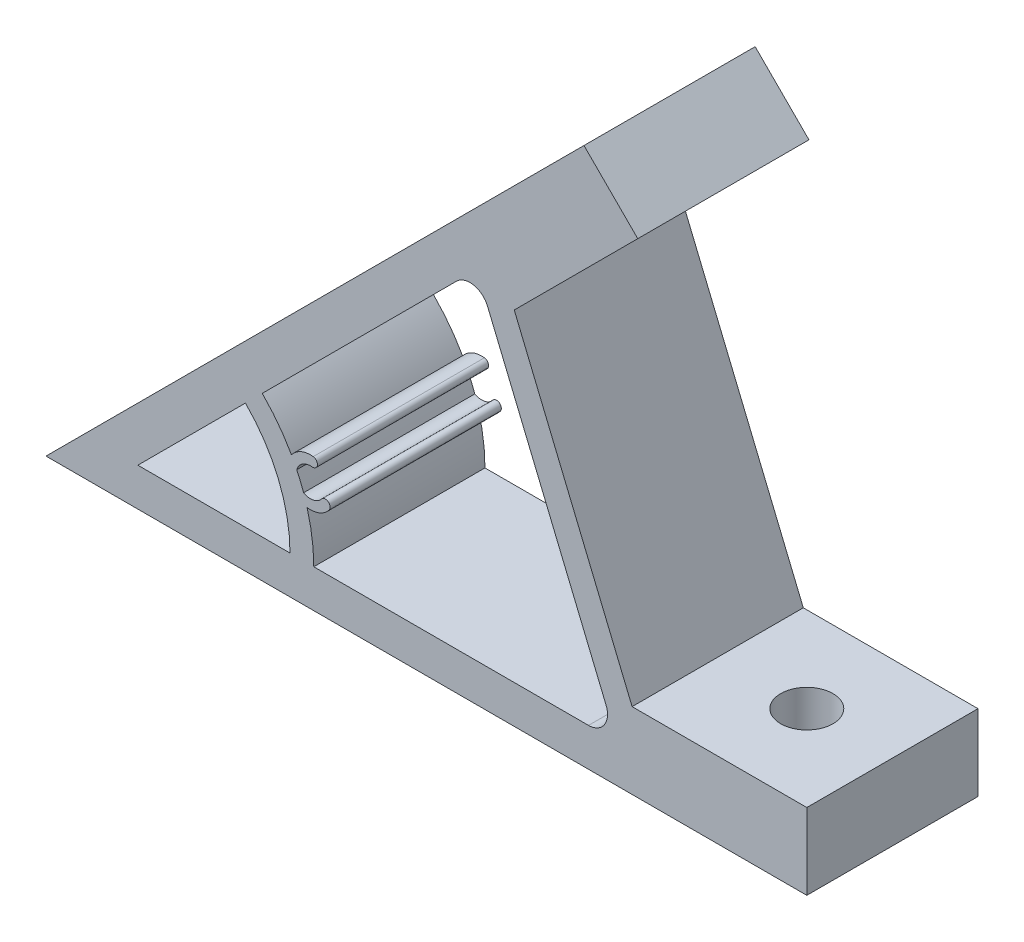
ISO-10303-21;
HEADER;
FILE_DESCRIPTION(('STEP AP214'),'2;1');
FILE_NAME('part.step','',(''),(''),'','','');
FILE_SCHEMA(('AUTOMOTIVE_DESIGN { 1 0 10303 214 1 1 1 1 }'));
ENDSEC;
DATA;
#1=APPLICATION_CONTEXT('core data for automotive mechanical design processes');
#2=APPLICATION_PROTOCOL_DEFINITION('international standard','automotive_design',2000,#1);
#3=PRODUCT_CONTEXT('',#1,'mechanical');
#4=PRODUCT('Part','Part','',(#3));
#5=PRODUCT_RELATED_PRODUCT_CATEGORY('part','',(#4));
#6=PRODUCT_DEFINITION_FORMATION('','',#4);
#7=PRODUCT_DEFINITION_CONTEXT('part definition',#1,'design');
#8=PRODUCT_DEFINITION('design','',#6,#7);
#9=PRODUCT_DEFINITION_SHAPE('','',#8);
#10=(LENGTH_UNIT() NAMED_UNIT(*) SI_UNIT(.MILLI.,.METRE.));
#11=(NAMED_UNIT(*) PLANE_ANGLE_UNIT() SI_UNIT($,.RADIAN.));
#12=(NAMED_UNIT(*) SI_UNIT($,.STERADIAN.) SOLID_ANGLE_UNIT());
#13=UNCERTAINTY_MEASURE_WITH_UNIT(LENGTH_MEASURE(1.E-05),#10,'distance_accuracy_value','');
#14=(GEOMETRIC_REPRESENTATION_CONTEXT(3) GLOBAL_UNCERTAINTY_ASSIGNED_CONTEXT((#13)) GLOBAL_UNIT_ASSIGNED_CONTEXT((#10,
#11,#12)) REPRESENTATION_CONTEXT('',''));
#15=CARTESIAN_POINT('',(0.,0.,0.));
#16=DIRECTION('',(0.,0.,1.));
#17=DIRECTION('',(1.,0.,0.));
#18=AXIS2_PLACEMENT_3D('',#15,#16,#17);
#19=CARTESIAN_POINT('',(80.,0.,18.));
#20=DIRECTION('',(-1.,0.,0.));
#21=DIRECTION('',(0.,0.,1.));
#22=AXIS2_PLACEMENT_3D('',#19,#20,#21);
#23=PLANE('',#22);
#24=DIRECTION('',(0.,1.,0.));
#25=VECTOR('',#24,1.);
#26=CARTESIAN_POINT('',(80.,0.,0.));
#27=LINE('',#26,#25);
#28=CARTESIAN_POINT('',(80.,0.,0.));
#29=VERTEX_POINT('',#28);
#30=CARTESIAN_POINT('',(80.,8.,0.));
#31=VERTEX_POINT('',#30);
#32=EDGE_CURVE('E275',#29,#31,#27,.T.);
#33=ORIENTED_EDGE('',*,*,#32,.T.);
#34=DIRECTION('',(0.,0.,-1.));
#35=VECTOR('',#34,1.);
#36=CARTESIAN_POINT('',(80.,8.,18.));
#37=LINE('',#36,#35);
#38=CARTESIAN_POINT('',(80.,8.,18.));
#39=VERTEX_POINT('',#38);
#40=EDGE_CURVE('E11',#39,#31,#37,.T.);
#41=ORIENTED_EDGE('',*,*,#40,.F.);
#42=DIRECTION('',(0.,1.,0.));
#43=VECTOR('',#42,1.);
#44=CARTESIAN_POINT('',(80.,0.,18.));
#45=LINE('',#44,#43);
#46=CARTESIAN_POINT('',(80.,0.,18.));
#47=VERTEX_POINT('',#46);
#48=EDGE_CURVE('E384',#47,#39,#45,.T.);
#49=ORIENTED_EDGE('',*,*,#48,.F.);
#50=DIRECTION('',(0.,0.,-1.));
#51=VECTOR('',#50,1.);
#52=CARTESIAN_POINT('',(80.,0.,18.));
#53=LINE('',#52,#51);
#54=EDGE_CURVE('E292',#47,#29,#53,.T.);
#55=ORIENTED_EDGE('',*,*,#54,.T.);
#56=EDGE_LOOP('',(#33,#41,#49,#55));
#57=FACE_BOUND('',#56,.T.);
#58=ADVANCED_FACE('F32',(#57),#23,.F.);
#59=CARTESIAN_POINT('',(0.,7.99999999999999,18.));
#60=DIRECTION('',(0.,-1.,0.));
#61=DIRECTION('',(1.,0.,0.));
#62=AXIS2_PLACEMENT_3D('',#59,#60,#61);
#63=PLANE('',#62);
#64=CARTESIAN_POINT('',(71.,8.,9.));
#65=DIRECTION('',(0.,1.,0.));
#66=DIRECTION('',(-1.,0.,0.));
#67=AXIS2_PLACEMENT_3D('',#64,#65,#66);
#68=CIRCLE('',#67,2.75000000000001);
#69=CARTESIAN_POINT('',(68.25,8.,9.));
#70=VERTEX_POINT('',#69);
#71=EDGE_CURVE('E332',#70,#70,#68,.T.);
#72=ORIENTED_EDGE('',*,*,#71,.F.);
#73=EDGE_LOOP('',(#72));
#74=FACE_BOUND('',#73,.T.);
#75=DIRECTION('',(-1.,0.,0.));
#76=VECTOR('',#75,1.);
#77=CARTESIAN_POINT('',(0.,7.99999999999999,0.));
#78=LINE('',#77,#76);
#79=CARTESIAN_POINT('',(61.6298235185589,8.,0.));
#80=VERTEX_POINT('',#79);
#81=EDGE_CURVE('E278',#31,#80,#78,.T.);
#82=ORIENTED_EDGE('',*,*,#81,.T.);
#83=DIRECTION('',(0.,0.,-1.));
#84=VECTOR('',#83,1.);
#85=CARTESIAN_POINT('',(61.6298235185589,8.,18.));
#86=LINE('',#85,#84);
#87=CARTESIAN_POINT('',(61.6298235185589,8.,18.));
#88=VERTEX_POINT('',#87);
#89=EDGE_CURVE('E42',#88,#80,#86,.T.);
#90=ORIENTED_EDGE('',*,*,#89,.F.);
#91=DIRECTION('',(-1.,0.,0.));
#92=VECTOR('',#91,1.);
#93=CARTESIAN_POINT('',(0.,7.99999999999999,18.));
#94=LINE('',#93,#92);
#95=EDGE_CURVE('E386',#39,#88,#94,.T.);
#96=ORIENTED_EDGE('',*,*,#95,.F.);
#97=ORIENTED_EDGE('',*,*,#40,.T.);
#98=EDGE_LOOP('',(#82,#90,#96,#97));
#99=FACE_BOUND('',#98,.T.);
#100=ADVANCED_FACE('F416',(#74,#99),#63,.F.);
#101=CARTESIAN_POINT('',(55.4327719506771,22.9610059419056,18.));
#102=DIRECTION('',(0.923879532511285,0.382683432365094,0.));
#103=DIRECTION('',(-0.382683432365094,0.923879532511285,0.));
#104=AXIS2_PLACEMENT_3D('',#101,#102,#103);
#105=PLANE('',#104);
#106=DIRECTION('',(0.382683432365094,-0.923879532511285,0.));
#107=VECTOR('',#106,1.);
#108=CARTESIAN_POINT('',(55.4327719506771,22.9610059419056,0.));
#109=LINE('',#108,#107);
#110=CARTESIAN_POINT('',(49.2357203827954,37.9220118838108,0.));
#111=VERTEX_POINT('',#110);
#112=EDGE_CURVE('E281',#111,#80,#109,.T.);
#113=ORIENTED_EDGE('',*,*,#112,.F.);
#114=DIRECTION('',(0.,0.,-1.));
#115=VECTOR('',#114,1.);
#116=CARTESIAN_POINT('',(49.2357203827954,37.9220118838108,18.));
#117=LINE('',#116,#115);
#118=CARTESIAN_POINT('',(49.2357203827954,37.9220118838108,18.));
#119=VERTEX_POINT('',#118);
#120=EDGE_CURVE('E297',#119,#111,#117,.T.);
#121=ORIENTED_EDGE('',*,*,#120,.F.);
#122=DIRECTION('',(0.382683432365094,-0.923879532511285,0.));
#123=VECTOR('',#122,1.);
#124=CARTESIAN_POINT('',(55.4327719506771,22.9610059419056,18.));
#125=LINE('',#124,#123);
#126=EDGE_CURVE('E388',#119,#88,#125,.T.);
#127=ORIENTED_EDGE('',*,*,#126,.T.);
#128=ORIENTED_EDGE('',*,*,#89,.T.);
#129=EDGE_LOOP('',(#113,#121,#127,#128));
#130=FACE_BOUND('',#129,.T.);
#131=ADVANCED_FACE('F421',(#130),#105,.T.);
#132=CARTESIAN_POINT('',(5.65685424949238,-5.65685424949236,18.));
#133=DIRECTION('',(0.707106781186549,-0.707106781186546,0.));
#134=DIRECTION('',(0.707106781186546,0.707106781186549,0.));
#135=AXIS2_PLACEMENT_3D('',#132,#133,#134);
#136=PLANE('',#135);
#137=CARTESIAN_POINT('',(55.8614357137372,44.5477272147526,9.));
#138=DIRECTION('',(0.707106781186549,-0.707106781186546,0.));
#139=DIRECTION('',(0.707106781186546,0.707106781186549,0.));
#140=AXIS2_PLACEMENT_3D('',#137,#138,#139);
#141=CIRCLE('',#140,2.75);
#142=CARTESIAN_POINT('',(57.8059793620002,46.4922708630156,9.));
#143=VERTEX_POINT('',#142);
#144=EDGE_CURVE('E340',#143,#143,#141,.T.);
#145=ORIENTED_EDGE('',*,*,#144,.F.);
#146=EDGE_LOOP('',(#145));
#147=FACE_BOUND('',#146,.T.);
#148=DIRECTION('',(-0.707106781186546,-0.707106781186549,0.));
#149=VECTOR('',#148,1.);
#150=CARTESIAN_POINT('',(5.65685424949238,-5.65685424949236,0.));
#151=LINE('',#150,#149);
#152=CARTESIAN_POINT('',(62.2253967444161,50.9116882454316,0.));
#153=VERTEX_POINT('',#152);
#154=EDGE_CURVE('E284',#153,#111,#151,.T.);
#155=ORIENTED_EDGE('',*,*,#154,.F.);
#156=DIRECTION('',(0.,0.,-1.));
#157=VECTOR('',#156,1.);
#158=CARTESIAN_POINT('',(62.2253967444161,50.9116882454316,18.));
#159=LINE('',#158,#157);
#160=CARTESIAN_POINT('',(62.2253967444161,50.9116882454316,18.));
#161=VERTEX_POINT('',#160);
#162=EDGE_CURVE('E213',#161,#153,#159,.T.);
#163=ORIENTED_EDGE('',*,*,#162,.F.);
#164=DIRECTION('',(-0.707106781186546,-0.707106781186549,0.));
#165=VECTOR('',#164,1.);
#166=CARTESIAN_POINT('',(5.65685424949238,-5.65685424949236,18.));
#167=LINE('',#166,#165);
#168=EDGE_CURVE('E220',#161,#119,#167,.T.);
#169=ORIENTED_EDGE('',*,*,#168,.T.);
#170=ORIENTED_EDGE('',*,*,#120,.T.);
#171=EDGE_LOOP('',(#155,#163,#169,#170));
#172=FACE_BOUND('',#171,.T.);
#173=ADVANCED_FACE('F392',(#147,#172),#136,.T.);
#174=CARTESIAN_POINT('',(56.5685424949237,56.5685424949239,18.));
#175=DIRECTION('',(0.707106781186546,0.707106781186549,0.));
#176=DIRECTION('',(-0.707106781186549,0.707106781186546,0.));
#177=AXIS2_PLACEMENT_3D('',#174,#175,#176);
#178=PLANE('',#177);
#179=DIRECTION('',(0.707106781186549,-0.707106781186546,0.));
#180=VECTOR('',#179,1.);
#181=CARTESIAN_POINT('',(56.5685424949237,56.5685424949239,0.));
#182=LINE('',#181,#180);
#183=CARTESIAN_POINT('',(56.5685424949237,56.5685424949239,0.));
#184=VERTEX_POINT('',#183);
#185=EDGE_CURVE('E208',#184,#153,#182,.T.);
#186=ORIENTED_EDGE('',*,*,#185,.F.);
#187=DIRECTION('',(0.,0.,-1.));
#188=VECTOR('',#187,1.);
#189=CARTESIAN_POINT('',(56.5685424949237,56.5685424949239,18.));
#190=LINE('',#189,#188);
#191=CARTESIAN_POINT('',(56.5685424949237,56.5685424949239,18.));
#192=VERTEX_POINT('',#191);
#193=EDGE_CURVE('E203',#192,#184,#190,.T.);
#194=ORIENTED_EDGE('',*,*,#193,.F.);
#195=DIRECTION('',(0.707106781186549,-0.707106781186546,0.));
#196=VECTOR('',#195,1.);
#197=CARTESIAN_POINT('',(56.5685424949237,56.5685424949239,18.));
#198=LINE('',#197,#196);
#199=EDGE_CURVE('E206',#192,#161,#198,.T.);
#200=ORIENTED_EDGE('',*,*,#199,.T.);
#201=ORIENTED_EDGE('',*,*,#162,.T.);
#202=EDGE_LOOP('',(#186,#194,#200,#201));
#203=FACE_BOUND('',#202,.T.);
#204=ADVANCED_FACE('F205',(#203),#178,.T.);
#205=CARTESIAN_POINT('',(0.,0.,18.));
#206=DIRECTION('',(-0.707106781186549,0.707106781186546,0.));
#207=DIRECTION('',(-0.707106781186546,-0.707106781186549,0.));
#208=AXIS2_PLACEMENT_3D('',#205,#206,#207);
#209=PLANE('',#208);
#210=CARTESIAN_POINT('',(50.2045814642448,50.204581464245,9.));
#211=DIRECTION('',(-0.707106781186549,0.707106781186546,0.));
#212=DIRECTION('',(-0.707106781186546,-0.707106781186549,0.));
#213=AXIS2_PLACEMENT_3D('',#210,#211,#212);
#214=CIRCLE('',#213,2.75);
#215=CARTESIAN_POINT('',(48.2600378159818,48.260037815982,9.));
#216=VERTEX_POINT('',#215);
#217=EDGE_CURVE('E36',#216,#216,#214,.T.);
#218=ORIENTED_EDGE('',*,*,#217,.F.);
#219=EDGE_LOOP('',(#218));
#220=FACE_BOUND('',#219,.T.);
#221=DIRECTION('',(0.707106781186546,0.707106781186549,0.));
#222=VECTOR('',#221,1.);
#223=CARTESIAN_POINT('',(0.,0.,0.));
#224=LINE('',#223,#222);
#225=CARTESIAN_POINT('',(0.,0.,0.));
#226=VERTEX_POINT('',#225);
#227=EDGE_CURVE('E288',#226,#184,#224,.T.);
#228=ORIENTED_EDGE('',*,*,#227,.F.);
#229=DIRECTION('',(0.,0.,-1.));
#230=VECTOR('',#229,1.);
#231=CARTESIAN_POINT('',(0.,0.,18.));
#232=LINE('',#231,#230);
#233=CARTESIAN_POINT('',(0.,0.,18.));
#234=VERTEX_POINT('',#233);
#235=EDGE_CURVE('E127',#234,#226,#232,.T.);
#236=ORIENTED_EDGE('',*,*,#235,.F.);
#237=DIRECTION('',(0.707106781186546,0.707106781186549,0.));
#238=VECTOR('',#237,1.);
#239=CARTESIAN_POINT('',(0.,0.,18.));
#240=LINE('',#239,#238);
#241=EDGE_CURVE('E217',#234,#192,#240,.T.);
#242=ORIENTED_EDGE('',*,*,#241,.T.);
#243=ORIENTED_EDGE('',*,*,#193,.T.);
#244=EDGE_LOOP('',(#228,#236,#242,#243));
#245=FACE_BOUND('',#244,.T.);
#246=ADVANCED_FACE('F222',(#220,#245),#209,.T.);
#247=CARTESIAN_POINT('',(9.65685424949237,4.,18.));
#248=DIRECTION('',(0.,0.,-1.));
#249=DIRECTION('',(-1.,0.,0.));
#250=AXIS2_PLACEMENT_3D('',#247,#248,#249);
#251=CYLINDRICAL_SURFACE('',#250,16.);
#252=CARTESIAN_POINT('',(9.65685424949237,4.,0.));
#253=DIRECTION('',(0.,0.,1.));
#254=DIRECTION('',(1.,0.,0.));
#255=AXIS2_PLACEMENT_3D('',#252,#253,#254);
#256=CIRCLE('',#255,16.);
#257=CARTESIAN_POINT('',(20.9705627484771,15.3137084989848,0.));
#258=VERTEX_POINT('',#257);
#259=CARTESIAN_POINT('',(25.6568542494923,4.,0.));
#260=VERTEX_POINT('',#259);
#261=EDGE_CURVE('E272',#258,#260,#256,.F.);
#262=ORIENTED_EDGE('',*,*,#261,.T.);
#263=DIRECTION('',(0.,0.,-1.));
#264=VECTOR('',#263,1.);
#265=CARTESIAN_POINT('',(25.6568542494923,4.,18.));
#266=LINE('',#265,#264);
#267=CARTESIAN_POINT('',(25.6568542494923,4.,18.));
#268=VERTEX_POINT('',#267);
#269=EDGE_CURVE('E294',#268,#260,#266,.T.);
#270=ORIENTED_EDGE('',*,*,#269,.F.);
#271=CARTESIAN_POINT('',(9.65685424949237,4.,18.));
#272=DIRECTION('',(0.,0.,1.));
#273=DIRECTION('',(1.,0.,0.));
#274=AXIS2_PLACEMENT_3D('',#271,#272,#273);
#275=CIRCLE('',#274,16.);
#276=CARTESIAN_POINT('',(20.9705627484771,15.3137084989848,18.));
#277=VERTEX_POINT('',#276);
#278=EDGE_CURVE('E382',#277,#268,#275,.F.);
#279=ORIENTED_EDGE('',*,*,#278,.F.);
#280=DIRECTION('',(0.,0.,-1.));
#281=VECTOR('',#280,1.);
#282=CARTESIAN_POINT('',(20.9705627484771,15.3137084989848,18.));
#283=LINE('',#282,#281);
#284=EDGE_CURVE('E300',#277,#258,#283,.T.);
#285=ORIENTED_EDGE('',*,*,#284,.T.);
#286=EDGE_LOOP('',(#262,#270,#279,#285));
#287=FACE_BOUND('',#286,.T.);
#288=ADVANCED_FACE('F435',(#287),#251,.F.);
#289=CARTESIAN_POINT('',(0.,4.,18.));
#290=DIRECTION('',(0.,1.,0.));
#291=DIRECTION('',(-1.,0.,0.));
#292=AXIS2_PLACEMENT_3D('',#289,#290,#291);
#293=PLANE('',#292);
#294=DIRECTION('',(1.,0.,0.));
#295=VECTOR('',#294,1.);
#296=CARTESIAN_POINT('',(0.,4.,0.));
#297=LINE('',#296,#295);
#298=CARTESIAN_POINT('',(9.65685424949238,4.,0.));
#299=VERTEX_POINT('',#298);
#300=EDGE_CURVE('E233',#299,#260,#297,.T.);
#301=ORIENTED_EDGE('',*,*,#300,.F.);
#302=DIRECTION('',(0.,0.,-1.));
#303=VECTOR('',#302,1.);
#304=CARTESIAN_POINT('',(9.65685424949238,4.,18.));
#305=LINE('',#304,#303);
#306=CARTESIAN_POINT('',(9.65685424949238,4.,18.));
#307=VERTEX_POINT('',#306);
#308=EDGE_CURVE('E302',#307,#299,#305,.T.);
#309=ORIENTED_EDGE('',*,*,#308,.F.);
#310=DIRECTION('',(1.,0.,0.));
#311=VECTOR('',#310,1.);
#312=CARTESIAN_POINT('',(0.,4.,18.));
#313=LINE('',#312,#311);
#314=EDGE_CURVE('E345',#307,#268,#313,.T.);
#315=ORIENTED_EDGE('',*,*,#314,.T.);
#316=ORIENTED_EDGE('',*,*,#269,.T.);
#317=EDGE_LOOP('',(#301,#309,#315,#316));
#318=FACE_BOUND('',#317,.T.);
#319=ADVANCED_FACE('F431',(#318),#293,.T.);
#320=CARTESIAN_POINT('',(28.1568542494924,4.,0.));
#321=VERTEX_POINT('',#320);
#322=CARTESIAN_POINT('',(57.0462896418432,4.,0.));
#323=VERTEX_POINT('',#322);
#324=EDGE_CURVE('E228',#321,#323,#297,.T.);
#325=ORIENTED_EDGE('',*,*,#324,.F.);
#326=DIRECTION('',(0.,0.,-1.));
#327=VECTOR('',#326,1.);
#328=CARTESIAN_POINT('',(28.1568542494924,4.,18.));
#329=LINE('',#328,#327);
#330=CARTESIAN_POINT('',(28.1568542494924,4.,18.));
#331=VERTEX_POINT('',#330);
#332=EDGE_CURVE('E138',#331,#321,#329,.T.);
#333=ORIENTED_EDGE('',*,*,#332,.F.);
#334=CARTESIAN_POINT('',(57.0462896418432,4.,18.));
#335=VERTEX_POINT('',#334);
#336=EDGE_CURVE('E291',#331,#335,#313,.T.);
#337=ORIENTED_EDGE('',*,*,#336,.T.);
#338=DIRECTION('',(0.,0.,-1.));
#339=VECTOR('',#338,1.);
#340=CARTESIAN_POINT('',(57.0462896418432,4.,18.));
#341=LINE('',#340,#339);
#342=EDGE_CURVE('E224',#335,#323,#341,.T.);
#343=ORIENTED_EDGE('',*,*,#342,.T.);
#344=EDGE_LOOP('',(#325,#333,#337,#343));
#345=FACE_BOUND('',#344,.T.);
#346=ADVANCED_FACE('F434',(#345),#293,.T.);
#347=CARTESIAN_POINT('',(9.65685424949237,4.,18.));
#348=DIRECTION('',(0.,0.,-1.));
#349=DIRECTION('',(-1.,0.,0.));
#350=AXIS2_PLACEMENT_3D('',#347,#348,#349);
#351=CYLINDRICAL_SURFACE('',#350,18.5);
#352=CARTESIAN_POINT('',(9.65685424949237,4.,0.));
#353=DIRECTION('',(0.,0.,1.));
#354=DIRECTION('',(1.,0.,0.));
#355=AXIS2_PLACEMENT_3D('',#352,#353,#354);
#356=CIRCLE('',#355,18.5);
#357=CARTESIAN_POINT('',(27.4562706522649,9.04289358609855,0.));
#358=VERTEX_POINT('',#357);
#359=EDGE_CURVE('E231',#358,#321,#356,.F.);
#360=ORIENTED_EDGE('',*,*,#359,.F.);
#361=DIRECTION('',(0.,0.,-1.));
#362=VECTOR('',#361,1.);
#363=CARTESIAN_POINT('',(27.4562706522649,9.04289358609855,18.));
#364=LINE('',#363,#362);
#365=CARTESIAN_POINT('',(27.4562706522649,9.04289358609855,18.));
#366=VERTEX_POINT('',#365);
#367=EDGE_CURVE('E329',#366,#358,#364,.T.);
#368=ORIENTED_EDGE('',*,*,#367,.F.);
#369=CARTESIAN_POINT('',(9.65685424949237,4.,18.));
#370=DIRECTION('',(0.,0.,1.));
#371=DIRECTION('',(1.,0.,0.));
#372=AXIS2_PLACEMENT_3D('',#369,#370,#371);
#373=CIRCLE('',#372,18.5);
#374=EDGE_CURVE('E344',#366,#331,#373,.F.);
#375=ORIENTED_EDGE('',*,*,#374,.T.);
#376=ORIENTED_EDGE('',*,*,#332,.T.);
#377=EDGE_LOOP('',(#360,#368,#375,#376));
#378=FACE_BOUND('',#377,.T.);
#379=ADVANCED_FACE('F34',(#378),#351,.T.);
#380=CARTESIAN_POINT('',(27.8072384761432,11.5181353089616,18.));
#381=DIRECTION('',(0.,0.,-1.));
#382=DIRECTION('',(-1.,0.,0.));
#383=AXIS2_PLACEMENT_3D('',#380,#381,#382);
#384=CYLINDRICAL_SURFACE('',#383,2.49999999999998);
#385=CARTESIAN_POINT('',(27.8072384761432,11.5181353089616,0.));
#386=DIRECTION('',(0.,0.,1.));
#387=DIRECTION('',(1.,0.,0.));
#388=AXIS2_PLACEMENT_3D('',#385,#386,#387);
#389=CIRCLE('',#388,2.49999999999998);
#390=CARTESIAN_POINT('',(29.769286429246,9.9688232584938,0.));
#391=VERTEX_POINT('',#390);
#392=EDGE_CURVE('E236',#358,#391,#389,.T.);
#393=ORIENTED_EDGE('',*,*,#392,.T.);
#394=DIRECTION('',(0.,0.,-1.));
#395=VECTOR('',#394,1.);
#396=CARTESIAN_POINT('',(29.769286429246,9.9688232584938,18.));
#397=LINE('',#396,#395);
#398=CARTESIAN_POINT('',(29.769286429246,9.9688232584938,18.));
#399=VERTEX_POINT('',#398);
#400=EDGE_CURVE('E326',#399,#391,#397,.T.);
#401=ORIENTED_EDGE('',*,*,#400,.F.);
#402=CARTESIAN_POINT('',(27.8072384761432,11.5181353089616,18.));
#403=DIRECTION('',(0.,0.,1.));
#404=DIRECTION('',(1.,0.,0.));
#405=AXIS2_PLACEMENT_3D('',#402,#403,#404);
#406=CIRCLE('',#405,2.49999999999998);
#407=EDGE_CURVE('E348',#366,#399,#406,.T.);
#408=ORIENTED_EDGE('',*,*,#407,.F.);
#409=ORIENTED_EDGE('',*,*,#367,.T.);
#410=EDGE_LOOP('',(#393,#401,#408,#409));
#411=FACE_BOUND('',#410,.T.);
#412=ADVANCED_FACE('F473',(#411),#384,.T.);
#413=CARTESIAN_POINT('',(29.3768768386257,10.2786856685872,18.));
#414=DIRECTION('',(0.,0.,-1.));
#415=DIRECTION('',(-1.,0.,0.));
#416=AXIS2_PLACEMENT_3D('',#413,#414,#415);
#417=CYLINDRICAL_SURFACE('',#416,0.499999999999977);
#418=CARTESIAN_POINT('',(29.3768768386257,10.2786856685872,0.));
#419=DIRECTION('',(0.,0.,1.));
#420=DIRECTION('',(1.,0.,0.));
#421=AXIS2_PLACEMENT_3D('',#418,#419,#420);
#422=CIRCLE('',#421,0.499999999999977);
#423=CARTESIAN_POINT('',(28.9844672480049,10.5885480786809,0.));
#424=VERTEX_POINT('',#423);
#425=EDGE_CURVE('E238',#391,#424,#422,.T.);
#426=ORIENTED_EDGE('',*,*,#425,.T.);
#427=DIRECTION('',(0.,0.,-1.));
#428=VECTOR('',#427,1.);
#429=CARTESIAN_POINT('',(28.9844672480049,10.5885480786809,18.));
#430=LINE('',#429,#428);
#431=CARTESIAN_POINT('',(28.9844672480049,10.5885480786809,18.));
#432=VERTEX_POINT('',#431);
#433=EDGE_CURVE('E324',#432,#424,#430,.T.);
#434=ORIENTED_EDGE('',*,*,#433,.F.);
#435=CARTESIAN_POINT('',(29.3768768386257,10.2786856685872,18.));
#436=DIRECTION('',(0.,0.,1.));
#437=DIRECTION('',(1.,0.,0.));
#438=AXIS2_PLACEMENT_3D('',#435,#436,#437);
#439=CIRCLE('',#438,0.499999999999977);
#440=EDGE_CURVE('E350',#399,#432,#439,.T.);
#441=ORIENTED_EDGE('',*,*,#440,.F.);
#442=ORIENTED_EDGE('',*,*,#400,.T.);
#443=EDGE_LOOP('',(#426,#434,#441,#442));
#444=FACE_BOUND('',#443,.T.);
#445=ADVANCED_FACE('F470',(#444),#417,.T.);
#446=CARTESIAN_POINT('',(27.8072384761432,11.5181353089616,18.));
#447=DIRECTION('',(0.,0.,-1.));
#448=DIRECTION('',(-1.,0.,0.));
#449=AXIS2_PLACEMENT_3D('',#446,#447,#448);
#450=CYLINDRICAL_SURFACE('',#449,1.50000000000001);
#451=CARTESIAN_POINT('',(27.8072384761432,11.5181353089616,0.));
#452=DIRECTION('',(0.,0.,1.));
#453=DIRECTION('',(1.,0.,0.));
#454=AXIS2_PLACEMENT_3D('',#451,#452,#453);
#455=CIRCLE('',#454,1.50000000000001);
#456=CARTESIAN_POINT('',(27.085956296402,10.2029349374638,0.));
#457=VERTEX_POINT('',#456);
#458=EDGE_CURVE('E241',#457,#424,#455,.T.);
#459=ORIENTED_EDGE('',*,*,#458,.F.);
#460=DIRECTION('',(0.,0.,-1.));
#461=VECTOR('',#460,1.);
#462=CARTESIAN_POINT('',(27.085956296402,10.2029349374638,18.));
#463=LINE('',#462,#461);
#464=CARTESIAN_POINT('',(27.085956296402,10.2029349374638,18.));
#465=VERTEX_POINT('',#464);
#466=EDGE_CURVE('E322',#465,#457,#463,.T.);
#467=ORIENTED_EDGE('',*,*,#466,.F.);
#468=CARTESIAN_POINT('',(27.8072384761432,11.5181353089616,18.));
#469=DIRECTION('',(0.,0.,1.));
#470=DIRECTION('',(1.,0.,0.));
#471=AXIS2_PLACEMENT_3D('',#468,#469,#470);
#472=CIRCLE('',#471,1.50000000000001);
#473=EDGE_CURVE('E352',#465,#432,#472,.T.);
#474=ORIENTED_EDGE('',*,*,#473,.T.);
#475=ORIENTED_EDGE('',*,*,#433,.T.);
#476=EDGE_LOOP('',(#459,#467,#474,#475));
#477=FACE_BOUND('',#476,.T.);
#478=ADVANCED_FACE('F466',(#477),#450,.F.);
#479=CARTESIAN_POINT('',(9.65685424949237,4.,18.));
#480=DIRECTION('',(0.,0.,-1.));
#481=DIRECTION('',(-1.,0.,0.));
#482=AXIS2_PLACEMENT_3D('',#479,#480,#481);
#483=CYLINDRICAL_SURFACE('',#482,18.5);
#484=CARTESIAN_POINT('',(9.65685424949237,4.,0.));
#485=DIRECTION('',(0.,0.,1.));
#486=DIRECTION('',(1.,0.,0.));
#487=AXIS2_PLACEMENT_3D('',#484,#485,#486);
#488=CIRCLE('',#487,18.5);
#489=CARTESIAN_POINT('',(26.367227854394,11.9380988898228,0.));
#490=VERTEX_POINT('',#489);
#491=EDGE_CURVE('E244',#490,#457,#488,.F.);
#492=ORIENTED_EDGE('',*,*,#491,.F.);
#493=DIRECTION('',(0.,0.,-1.));
#494=VECTOR('',#493,1.);
#495=CARTESIAN_POINT('',(26.367227854394,11.9380988898228,18.));
#496=LINE('',#495,#494);
#497=CARTESIAN_POINT('',(26.367227854394,11.9380988898228,18.));
#498=VERTEX_POINT('',#497);
#499=EDGE_CURVE('E320',#498,#490,#496,.T.);
#500=ORIENTED_EDGE('',*,*,#499,.F.);
#501=CARTESIAN_POINT('',(9.65685424949237,4.,18.));
#502=DIRECTION('',(0.,0.,1.));
#503=DIRECTION('',(1.,0.,0.));
#504=AXIS2_PLACEMENT_3D('',#501,#502,#503);
#505=CIRCLE('',#504,18.5);
#506=EDGE_CURVE('E355',#498,#465,#505,.F.);
#507=ORIENTED_EDGE('',*,*,#506,.T.);
#508=ORIENTED_EDGE('',*,*,#466,.T.);
#509=EDGE_LOOP('',(#492,#500,#507,#508));
#510=FACE_BOUND('',#509,.T.);
#511=ADVANCED_FACE('F462',(#510),#483,.T.);
#512=CARTESIAN_POINT('',(27.8072384761432,11.5181353089616,18.));
#513=DIRECTION('',(0.,0.,-1.));
#514=DIRECTION('',(-1.,0.,0.));
#515=AXIS2_PLACEMENT_3D('',#512,#513,#514);
#516=CYLINDRICAL_SURFACE('',#515,1.5);
#517=CARTESIAN_POINT('',(27.8072384761432,11.5181353089616,0.));
#518=DIRECTION('',(0.,0.,1.));
#519=DIRECTION('',(1.,0.,0.));
#520=AXIS2_PLACEMENT_3D('',#517,#518,#519);
#521=CIRCLE('',#520,1.5);
#522=CARTESIAN_POINT('',(27.9823474894986,13.0078791907891,0.));
#523=VERTEX_POINT('',#522);
#524=EDGE_CURVE('E247',#523,#490,#521,.T.);
#525=ORIENTED_EDGE('',*,*,#524,.F.);
#526=DIRECTION('',(0.,0.,-1.));
#527=VECTOR('',#526,1.);
#528=CARTESIAN_POINT('',(27.9823474894986,13.0078791907891,18.));
#529=LINE('',#528,#527);
#530=CARTESIAN_POINT('',(27.9823474894986,13.0078791907891,18.));
#531=VERTEX_POINT('',#530);
#532=EDGE_CURVE('E318',#531,#523,#529,.T.);
#533=ORIENTED_EDGE('',*,*,#532,.F.);
#534=CARTESIAN_POINT('',(27.8072384761432,11.5181353089616,18.));
#535=DIRECTION('',(0.,0.,1.));
#536=DIRECTION('',(1.,0.,0.));
#537=AXIS2_PLACEMENT_3D('',#534,#535,#536);
#538=CIRCLE('',#537,1.5);
#539=EDGE_CURVE('E358',#531,#498,#538,.T.);
#540=ORIENTED_EDGE('',*,*,#539,.T.);
#541=ORIENTED_EDGE('',*,*,#499,.T.);
#542=EDGE_LOOP('',(#525,#533,#540,#541));
#543=FACE_BOUND('',#542,.T.);
#544=ADVANCED_FACE('F458',(#543),#516,.F.);
#545=CARTESIAN_POINT('',(28.0407171606171,13.5044604847315,18.));
#546=DIRECTION('',(0.,0.,-1.));
#547=DIRECTION('',(-1.,0.,0.));
#548=AXIS2_PLACEMENT_3D('',#545,#546,#547);
#549=CYLINDRICAL_SURFACE('',#548,0.499999999999975);
#550=CARTESIAN_POINT('',(28.0407171606171,13.5044604847315,0.));
#551=DIRECTION('',(0.,0.,1.));
#552=DIRECTION('',(1.,0.,0.));
#553=AXIS2_PLACEMENT_3D('',#550,#551,#552);
#554=CIRCLE('',#553,0.499999999999975);
#555=CARTESIAN_POINT('',(28.0990868317356,14.0010417786738,0.));
#556=VERTEX_POINT('',#555);
#557=EDGE_CURVE('E250',#556,#523,#554,.F.);
#558=ORIENTED_EDGE('',*,*,#557,.F.);
#559=DIRECTION('',(0.,0.,-1.));
#560=VECTOR('',#559,1.);
#561=CARTESIAN_POINT('',(28.0990868317356,14.0010417786738,18.));
#562=LINE('',#561,#560);
#563=CARTESIAN_POINT('',(28.0990868317356,14.0010417786738,18.));
#564=VERTEX_POINT('',#563);
#565=EDGE_CURVE('E316',#564,#556,#562,.T.);
#566=ORIENTED_EDGE('',*,*,#565,.F.);
#567=CARTESIAN_POINT('',(28.0407171606171,13.5044604847315,18.));
#568=DIRECTION('',(0.,0.,1.));
#569=DIRECTION('',(1.,0.,0.));
#570=AXIS2_PLACEMENT_3D('',#567,#568,#569);
#571=CIRCLE('',#570,0.499999999999975);
#572=EDGE_CURVE('E361',#564,#531,#571,.F.);
#573=ORIENTED_EDGE('',*,*,#572,.T.);
#574=ORIENTED_EDGE('',*,*,#532,.T.);
#575=EDGE_LOOP('',(#558,#566,#573,#574));
#576=FACE_BOUND('',#575,.T.);
#577=ADVANCED_FACE('F454',(#576),#549,.T.);
#578=CARTESIAN_POINT('',(27.8072384761432,11.5181353089616,18.));
#579=DIRECTION('',(0.,0.,-1.));
#580=DIRECTION('',(-1.,0.,0.));
#581=AXIS2_PLACEMENT_3D('',#578,#579,#580);
#582=CYLINDRICAL_SURFACE('',#581,2.49999999999997);
#583=CARTESIAN_POINT('',(27.8072384761432,11.5181353089616,0.));
#584=DIRECTION('',(0.,0.,1.));
#585=DIRECTION('',(1.,0.,0.));
#586=AXIS2_PLACEMENT_3D('',#583,#584,#585);
#587=CIRCLE('',#586,2.49999999999997);
#588=CARTESIAN_POINT('',(25.8088065405882,13.0202237880313,0.));
#589=VERTEX_POINT('',#588);
#590=EDGE_CURVE('E253',#556,#589,#587,.T.);
#591=ORIENTED_EDGE('',*,*,#590,.T.);
#592=DIRECTION('',(0.,0.,-1.));
#593=VECTOR('',#592,1.);
#594=CARTESIAN_POINT('',(25.8088065405882,13.0202237880313,18.));
#595=LINE('',#594,#593);
#596=CARTESIAN_POINT('',(25.8088065405882,13.0202237880313,18.));
#597=VERTEX_POINT('',#596);
#598=EDGE_CURVE('E314',#597,#589,#595,.T.);
#599=ORIENTED_EDGE('',*,*,#598,.F.);
#600=CARTESIAN_POINT('',(27.8072384761432,11.5181353089616,18.));
#601=DIRECTION('',(0.,0.,1.));
#602=DIRECTION('',(1.,0.,0.));
#603=AXIS2_PLACEMENT_3D('',#600,#601,#602);
#604=CIRCLE('',#603,2.49999999999997);
#605=EDGE_CURVE('E364',#564,#597,#604,.T.);
#606=ORIENTED_EDGE('',*,*,#605,.F.);
#607=ORIENTED_EDGE('',*,*,#565,.T.);
#608=EDGE_LOOP('',(#591,#599,#606,#607));
#609=FACE_BOUND('',#608,.T.);
#610=ADVANCED_FACE('F450',(#609),#582,.T.);
#611=CARTESIAN_POINT('',(9.65685424949237,4.,18.));
#612=DIRECTION('',(0.,0.,-1.));
#613=DIRECTION('',(-1.,0.,0.));
#614=AXIS2_PLACEMENT_3D('',#611,#612,#613);
#615=CYLINDRICAL_SURFACE('',#614,18.5);
#616=CARTESIAN_POINT('',(9.65685424949237,4.,0.));
#617=DIRECTION('',(0.,0.,1.));
#618=DIRECTION('',(1.,0.,0.));
#619=AXIS2_PLACEMENT_3D('',#616,#617,#618);
#620=CIRCLE('',#619,18.5);
#621=CARTESIAN_POINT('',(22.7383297014435,17.0814754519511,0.));
#622=VERTEX_POINT('',#621);
#623=EDGE_CURVE('E256',#622,#589,#620,.F.);
#624=ORIENTED_EDGE('',*,*,#623,.F.);
#625=DIRECTION('',(0.,0.,-1.));
#626=VECTOR('',#625,1.);
#627=CARTESIAN_POINT('',(22.7383297014435,17.0814754519511,18.));
#628=LINE('',#627,#626);
#629=CARTESIAN_POINT('',(22.7383297014435,17.0814754519511,18.));
#630=VERTEX_POINT('',#629);
#631=EDGE_CURVE('E312',#630,#622,#628,.T.);
#632=ORIENTED_EDGE('',*,*,#631,.F.);
#633=CARTESIAN_POINT('',(9.65685424949237,4.,18.));
#634=DIRECTION('',(0.,0.,1.));
#635=DIRECTION('',(1.,0.,0.));
#636=AXIS2_PLACEMENT_3D('',#633,#634,#635);
#637=CIRCLE('',#636,18.5);
#638=EDGE_CURVE('E366',#630,#597,#637,.F.);
#639=ORIENTED_EDGE('',*,*,#638,.T.);
#640=ORIENTED_EDGE('',*,*,#598,.T.);
#641=EDGE_LOOP('',(#624,#632,#639,#640));
#642=FACE_BOUND('',#641,.T.);
#643=ADVANCED_FACE('F447',(#642),#615,.T.);
#644=CARTESIAN_POINT('',(2.82842712474621,-2.8284271247462,18.));
#645=DIRECTION('',(0.707106781186549,-0.707106781186546,0.));
#646=DIRECTION('',(0.707106781186546,0.707106781186549,0.));
#647=AXIS2_PLACEMENT_3D('',#644,#645,#646);
#648=PLANE('',#647);
#649=DIRECTION('',(-0.707106781186546,-0.707106781186549,0.));
#650=VECTOR('',#649,1.);
#651=CARTESIAN_POINT('',(2.82842712474621,-2.8284271247462,0.));
#652=LINE('',#651,#650);
#653=CARTESIAN_POINT('',(43.1662453720253,37.509391122533,0.));
#654=VERTEX_POINT('',#653);
#655=EDGE_CURVE('E259',#654,#622,#652,.T.);
#656=ORIENTED_EDGE('',*,*,#655,.F.);
#657=DIRECTION('',(0.,0.,-1.));
#658=VECTOR('',#657,1.);
#659=CARTESIAN_POINT('',(43.1662453720253,37.509391122533,18.));
#660=LINE('',#659,#658);
#661=CARTESIAN_POINT('',(43.1662453720253,37.509391122533,18.));
#662=VERTEX_POINT('',#661);
#663=EDGE_CURVE('E310',#662,#654,#660,.T.);
#664=ORIENTED_EDGE('',*,*,#663,.F.);
#665=DIRECTION('',(-0.707106781186546,-0.707106781186549,0.));
#666=VECTOR('',#665,1.);
#667=CARTESIAN_POINT('',(2.82842712474621,-2.8284271247462,18.));
#668=LINE('',#667,#666);
#669=EDGE_CURVE('E369',#662,#630,#668,.T.);
#670=ORIENTED_EDGE('',*,*,#669,.T.);
#671=ORIENTED_EDGE('',*,*,#631,.T.);
#672=EDGE_LOOP('',(#656,#664,#670,#671));
#673=FACE_BOUND('',#672,.T.);
#674=ADVANCED_FACE('F430',(#673),#648,.T.);
#675=CARTESIAN_POINT('',(44.5804589343984,36.0951775601599,18.));
#676=DIRECTION('',(0.,0.,-1.));
#677=DIRECTION('',(-1.,0.,0.));
#678=AXIS2_PLACEMENT_3D('',#675,#676,#677);
#679=CYLINDRICAL_SURFACE('',#678,2.);
#680=CARTESIAN_POINT('',(44.5804589343984,36.0951775601599,0.));
#681=DIRECTION('',(0.,0.,1.));
#682=DIRECTION('',(1.,0.,0.));
#683=AXIS2_PLACEMENT_3D('',#680,#681,#682);
#684=CIRCLE('',#683,2.);
#685=CARTESIAN_POINT('',(46.4282179994209,36.8605444248901,0.));
#686=VERTEX_POINT('',#685);
#687=EDGE_CURVE('E262',#686,#654,#684,.T.);
#688=ORIENTED_EDGE('',*,*,#687,.F.);
#689=DIRECTION('',(0.,0.,-1.));
#690=VECTOR('',#689,1.);
#691=CARTESIAN_POINT('',(46.4282179994209,36.8605444248901,18.));
#692=LINE('',#691,#690);
#693=CARTESIAN_POINT('',(46.4282179994209,36.8605444248901,18.));
#694=VERTEX_POINT('',#693);
#695=EDGE_CURVE('E308',#694,#686,#692,.T.);
#696=ORIENTED_EDGE('',*,*,#695,.F.);
#697=CARTESIAN_POINT('',(44.5804589343984,36.0951775601599,18.));
#698=DIRECTION('',(0.,0.,1.));
#699=DIRECTION('',(1.,0.,0.));
#700=AXIS2_PLACEMENT_3D('',#697,#698,#699);
#701=CIRCLE('',#700,2.);
#702=EDGE_CURVE('E372',#694,#662,#701,.T.);
#703=ORIENTED_EDGE('',*,*,#702,.T.);
#704=ORIENTED_EDGE('',*,*,#663,.T.);
#705=EDGE_LOOP('',(#688,#696,#703,#704));
#706=FACE_BOUND('',#705,.T.);
#707=ADVANCED_FACE('F442',(#706),#679,.F.);
#708=CARTESIAN_POINT('',(52.6611333531433,21.8129556448103,18.));
#709=DIRECTION('',(-0.923879532511285,-0.382683432365093,0.));
#710=DIRECTION('',(0.382683432365094,-0.923879532511285,0.));
#711=AXIS2_PLACEMENT_3D('',#708,#709,#710);
#712=PLANE('',#711);
#713=DIRECTION('',(-0.382683432365093,0.923879532511285,0.));
#714=VECTOR('',#713,1.);
#715=CARTESIAN_POINT('',(52.6611333531433,21.8129556448103,0.));
#716=LINE('',#715,#714);
#717=CARTESIAN_POINT('',(58.8940487068657,6.76536686473018,0.));
#718=VERTEX_POINT('',#717);
#719=EDGE_CURVE('E266',#718,#686,#716,.T.);
#720=ORIENTED_EDGE('',*,*,#719,.F.);
#721=DIRECTION('',(0.,0.,-1.));
#722=VECTOR('',#721,1.);
#723=CARTESIAN_POINT('',(58.8940487068657,6.76536686473018,18.));
#724=LINE('',#723,#722);
#725=CARTESIAN_POINT('',(58.8940487068657,6.76536686473018,18.));
#726=VERTEX_POINT('',#725);
#727=EDGE_CURVE('E306',#726,#718,#724,.T.);
#728=ORIENTED_EDGE('',*,*,#727,.F.);
#729=DIRECTION('',(-0.382683432365093,0.923879532511285,0.));
#730=VECTOR('',#729,1.);
#731=CARTESIAN_POINT('',(52.6611333531433,21.8129556448103,18.));
#732=LINE('',#731,#730);
#733=EDGE_CURVE('E376',#726,#694,#732,.T.);
#734=ORIENTED_EDGE('',*,*,#733,.T.);
#735=ORIENTED_EDGE('',*,*,#695,.T.);
#736=EDGE_LOOP('',(#720,#728,#734,#735));
#737=FACE_BOUND('',#736,.T.);
#738=ADVANCED_FACE('F428',(#737),#712,.T.);
#739=EDGE_CURVE('E263',#258,#299,#652,.T.);
#740=ORIENTED_EDGE('',*,*,#739,.F.);
#741=ORIENTED_EDGE('',*,*,#284,.F.);
#742=EDGE_CURVE('E373',#277,#307,#668,.T.);
#743=ORIENTED_EDGE('',*,*,#742,.T.);
#744=ORIENTED_EDGE('',*,*,#308,.T.);
#745=EDGE_LOOP('',(#740,#741,#743,#744));
#746=FACE_BOUND('',#745,.T.);
#747=ADVANCED_FACE('F410',(#746),#648,.T.);
#748=CARTESIAN_POINT('',(57.0462896418432,6.,18.));
#749=DIRECTION('',(0.,0.,-1.));
#750=DIRECTION('',(-1.,0.,0.));
#751=AXIS2_PLACEMENT_3D('',#748,#749,#750);
#752=CYLINDRICAL_SURFACE('',#751,1.99999999999999);
#753=CARTESIAN_POINT('',(57.0462896418432,6.,0.));
#754=DIRECTION('',(0.,0.,1.));
#755=DIRECTION('',(1.,0.,0.));
#756=AXIS2_PLACEMENT_3D('',#753,#754,#755);
#757=CIRCLE('',#756,1.99999999999999);
#758=EDGE_CURVE('E269',#323,#718,#757,.T.);
#759=ORIENTED_EDGE('',*,*,#758,.F.);
#760=ORIENTED_EDGE('',*,*,#342,.F.);
#761=CARTESIAN_POINT('',(57.0462896418432,6.,18.));
#762=DIRECTION('',(0.,0.,1.));
#763=DIRECTION('',(1.,0.,0.));
#764=AXIS2_PLACEMENT_3D('',#761,#762,#763);
#765=CIRCLE('',#764,1.99999999999999);
#766=EDGE_CURVE('E379',#335,#726,#765,.T.);
#767=ORIENTED_EDGE('',*,*,#766,.T.);
#768=ORIENTED_EDGE('',*,*,#727,.T.);
#769=EDGE_LOOP('',(#759,#760,#767,#768));
#770=FACE_BOUND('',#769,.T.);
#771=ADVANCED_FACE('F402',(#770),#752,.F.);
#772=CARTESIAN_POINT('',(0.,0.,18.));
#773=DIRECTION('',(0.,1.,0.));
#774=DIRECTION('',(0.,0.,1.));
#775=AXIS2_PLACEMENT_3D('',#772,#773,#774);
#776=PLANE('',#775);
#777=CARTESIAN_POINT('',(71.,0.,9.));
#778=DIRECTION('',(0.,1.,0.));
#779=DIRECTION('',(0.,0.,1.));
#780=AXIS2_PLACEMENT_3D('',#777,#778,#779);
#781=CIRCLE('',#780,2.75000000000001);
#782=CARTESIAN_POINT('',(71.,0.,11.75));
#783=VERTEX_POINT('',#782);
#784=EDGE_CURVE('E232',#783,#783,#781,.T.);
#785=ORIENTED_EDGE('',*,*,#784,.T.);
#786=EDGE_LOOP('',(#785));
#787=FACE_BOUND('',#786,.T.);
#788=DIRECTION('',(1.,0.,0.));
#789=VECTOR('',#788,1.);
#790=CARTESIAN_POINT('',(0.,0.,0.));
#791=LINE('',#790,#789);
#792=EDGE_CURVE('E130',#226,#29,#791,.T.);
#793=ORIENTED_EDGE('',*,*,#792,.T.);
#794=ORIENTED_EDGE('',*,*,#54,.F.);
#795=DIRECTION('',(1.,0.,0.));
#796=VECTOR('',#795,1.);
#797=CARTESIAN_POINT('',(0.,0.,18.));
#798=LINE('',#797,#796);
#799=EDGE_CURVE('E51',#234,#47,#798,.T.);
#800=ORIENTED_EDGE('',*,*,#799,.F.);
#801=ORIENTED_EDGE('',*,*,#235,.T.);
#802=EDGE_LOOP('',(#793,#794,#800,#801));
#803=FACE_BOUND('',#802,.T.);
#804=ADVANCED_FACE('F400',(#787,#803),#776,.F.);
#805=CARTESIAN_POINT('',(0.,0.,18.));
#806=DIRECTION('',(0.,0.,1.));
#807=DIRECTION('',(1.,0.,0.));
#808=AXIS2_PLACEMENT_3D('',#805,#806,#807);
#809=PLANE('',#808);
#810=ORIENTED_EDGE('',*,*,#336,.F.);
#811=ORIENTED_EDGE('',*,*,#374,.F.);
#812=ORIENTED_EDGE('',*,*,#407,.T.);
#813=ORIENTED_EDGE('',*,*,#440,.T.);
#814=ORIENTED_EDGE('',*,*,#473,.F.);
#815=ORIENTED_EDGE('',*,*,#506,.F.);
#816=ORIENTED_EDGE('',*,*,#539,.F.);
#817=ORIENTED_EDGE('',*,*,#572,.F.);
#818=ORIENTED_EDGE('',*,*,#605,.T.);
#819=ORIENTED_EDGE('',*,*,#638,.F.);
#820=ORIENTED_EDGE('',*,*,#669,.F.);
#821=ORIENTED_EDGE('',*,*,#702,.F.);
#822=ORIENTED_EDGE('',*,*,#733,.F.);
#823=ORIENTED_EDGE('',*,*,#766,.F.);
#824=EDGE_LOOP('',(#810,#811,#812,#813,#814,#815,#816,#817,#818,#819,#820,#821,#822,#823));
#825=FACE_BOUND('',#824,.T.);
#826=ORIENTED_EDGE('',*,*,#278,.T.);
#827=ORIENTED_EDGE('',*,*,#314,.F.);
#828=ORIENTED_EDGE('',*,*,#742,.F.);
#829=EDGE_LOOP('',(#826,#827,#828));
#830=FACE_BOUND('',#829,.T.);
#831=ORIENTED_EDGE('',*,*,#48,.T.);
#832=ORIENTED_EDGE('',*,*,#95,.T.);
#833=ORIENTED_EDGE('',*,*,#126,.F.);
#834=ORIENTED_EDGE('',*,*,#168,.F.);
#835=ORIENTED_EDGE('',*,*,#199,.F.);
#836=ORIENTED_EDGE('',*,*,#241,.F.);
#837=ORIENTED_EDGE('',*,*,#799,.T.);
#838=EDGE_LOOP('',(#831,#832,#833,#834,#835,#836,#837));
#839=FACE_BOUND('',#838,.T.);
#840=ADVANCED_FACE('F216',(#825,#830,#839),#809,.T.);
#841=CARTESIAN_POINT('',(0.,0.,0.));
#842=DIRECTION('',(0.,0.,1.));
#843=DIRECTION('',(1.,0.,0.));
#844=AXIS2_PLACEMENT_3D('',#841,#842,#843);
#845=PLANE('',#844);
#846=ORIENTED_EDGE('',*,*,#324,.T.);
#847=ORIENTED_EDGE('',*,*,#758,.T.);
#848=ORIENTED_EDGE('',*,*,#719,.T.);
#849=ORIENTED_EDGE('',*,*,#687,.T.);
#850=ORIENTED_EDGE('',*,*,#655,.T.);
#851=ORIENTED_EDGE('',*,*,#623,.T.);
#852=ORIENTED_EDGE('',*,*,#590,.F.);
#853=ORIENTED_EDGE('',*,*,#557,.T.);
#854=ORIENTED_EDGE('',*,*,#524,.T.);
#855=ORIENTED_EDGE('',*,*,#491,.T.);
#856=ORIENTED_EDGE('',*,*,#458,.T.);
#857=ORIENTED_EDGE('',*,*,#425,.F.);
#858=ORIENTED_EDGE('',*,*,#392,.F.);
#859=ORIENTED_EDGE('',*,*,#359,.T.);
#860=EDGE_LOOP('',(#846,#847,#848,#849,#850,#851,#852,#853,#854,#855,#856,#857,#858,#859));
#861=FACE_BOUND('',#860,.T.);
#862=ORIENTED_EDGE('',*,*,#261,.F.);
#863=ORIENTED_EDGE('',*,*,#739,.T.);
#864=ORIENTED_EDGE('',*,*,#300,.T.);
#865=EDGE_LOOP('',(#862,#863,#864));
#866=FACE_BOUND('',#865,.T.);
#867=ORIENTED_EDGE('',*,*,#32,.F.);
#868=ORIENTED_EDGE('',*,*,#792,.F.);
#869=ORIENTED_EDGE('',*,*,#227,.T.);
#870=ORIENTED_EDGE('',*,*,#185,.T.);
#871=ORIENTED_EDGE('',*,*,#154,.T.);
#872=ORIENTED_EDGE('',*,*,#112,.T.);
#873=ORIENTED_EDGE('',*,*,#81,.F.);
#874=EDGE_LOOP('',(#867,#868,#869,#870,#871,#872,#873));
#875=FACE_BOUND('',#874,.T.);
#876=ADVANCED_FACE('F396',(#861,#866,#875),#845,.F.);
#877=CARTESIAN_POINT('',(71.,-20.,9.));
#878=DIRECTION('',(0.,1.,0.));
#879=DIRECTION('',(-1.,0.,0.));
#880=AXIS2_PLACEMENT_3D('',#877,#878,#879);
#881=CYLINDRICAL_SURFACE('',#880,2.75000000000001);
#882=ORIENTED_EDGE('',*,*,#71,.T.);
#883=EDGE_LOOP('',(#882));
#884=FACE_BOUND('',#883,.T.);
#885=ORIENTED_EDGE('',*,*,#784,.F.);
#886=EDGE_LOOP('',(#885));
#887=FACE_BOUND('',#886,.T.);
#888=ADVANCED_FACE('F618',(#884,#887),#881,.F.);
#889=CARTESIAN_POINT('',(36.0624458405138,64.3467170879759,9.));
#890=DIRECTION('',(0.707106781186549,-0.707106781186546,0.));
#891=DIRECTION('',(0.707106781186546,0.707106781186549,0.));
#892=AXIS2_PLACEMENT_3D('',#889,#890,#891);
#893=CYLINDRICAL_SURFACE('',#892,2.75);
#894=ORIENTED_EDGE('',*,*,#217,.T.);
#895=EDGE_LOOP('',(#894));
#896=FACE_BOUND('',#895,.T.);
#897=ORIENTED_EDGE('',*,*,#144,.T.);
#898=EDGE_LOOP('',(#897));
#899=FACE_BOUND('',#898,.T.);
#900=ADVANCED_FACE('F638',(#896,#899),#893,.F.);
#901=CLOSED_SHELL('',(#58,#100,#131,#173,#204,#246,#288,#319,#346,#379,#412,#445,#478,#511,#544,
#577,#610,#643,#674,#707,#738,#747,#771,#804,#840,#876,#888,#900));
#902=MANIFOLD_SOLID_BREP('B2',#901);
#903=ADVANCED_BREP_SHAPE_REPRESENTATION('',(#18,#902),#14);
#904=SHAPE_DEFINITION_REPRESENTATION(#9,#903);
ENDSEC;
END-ISO-10303-21;
